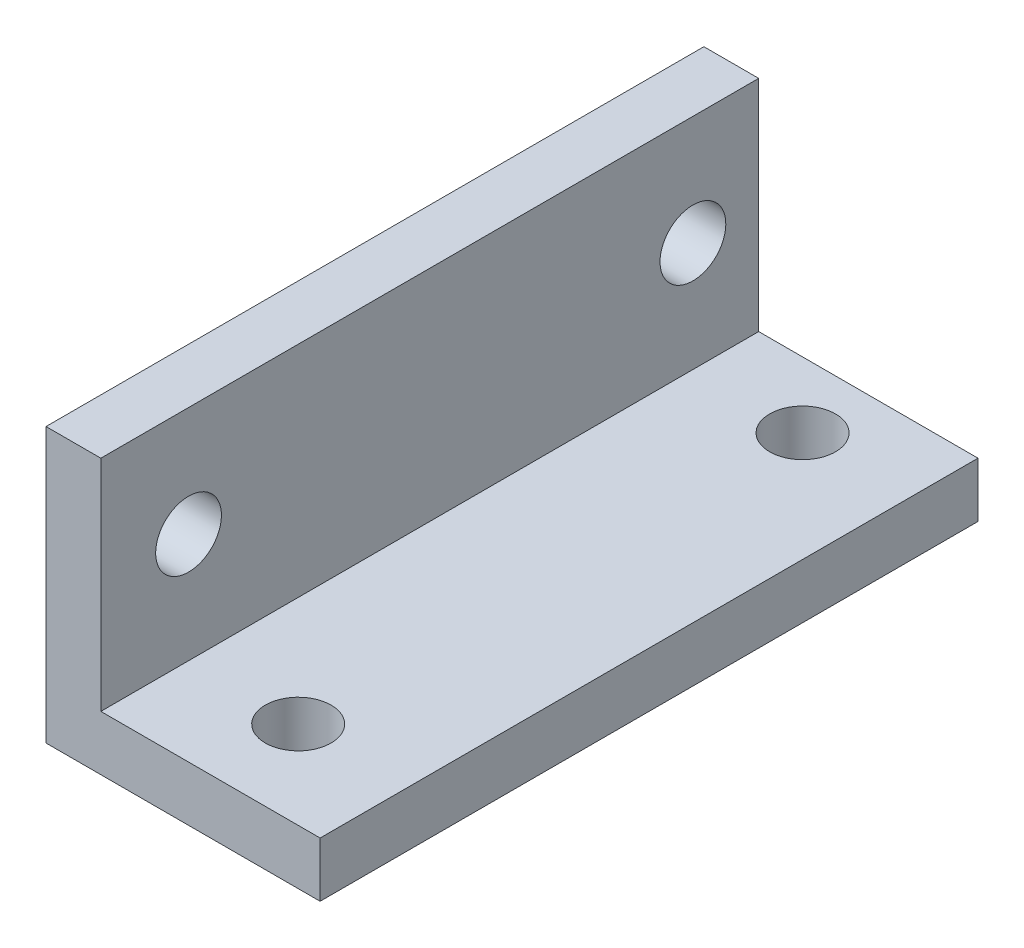
ISO-10303-21;
HEADER;
FILE_DESCRIPTION(('STEP AP214'),'2;1');
FILE_NAME('part.step','',(''),(''),'','','');
FILE_SCHEMA(('AUTOMOTIVE_DESIGN { 1 0 10303 214 1 1 1 1 }'));
ENDSEC;
DATA;
#1=APPLICATION_CONTEXT('core data for automotive mechanical design processes');
#2=APPLICATION_PROTOCOL_DEFINITION('international standard','automotive_design',2000,#1);
#3=PRODUCT_CONTEXT('',#1,'mechanical');
#4=PRODUCT('Part','Part','',(#3));
#5=PRODUCT_RELATED_PRODUCT_CATEGORY('part','',(#4));
#6=PRODUCT_DEFINITION_FORMATION('','',#4);
#7=PRODUCT_DEFINITION_CONTEXT('part definition',#1,'design');
#8=PRODUCT_DEFINITION('design','',#6,#7);
#9=PRODUCT_DEFINITION_SHAPE('','',#8);
#10=(LENGTH_UNIT() NAMED_UNIT(*) SI_UNIT(.MILLI.,.METRE.));
#11=(NAMED_UNIT(*) PLANE_ANGLE_UNIT() SI_UNIT($,.RADIAN.));
#12=(NAMED_UNIT(*) SI_UNIT($,.STERADIAN.) SOLID_ANGLE_UNIT());
#13=UNCERTAINTY_MEASURE_WITH_UNIT(LENGTH_MEASURE(1.E-05),#10,'distance_accuracy_value','');
#14=(GEOMETRIC_REPRESENTATION_CONTEXT(3) GLOBAL_UNCERTAINTY_ASSIGNED_CONTEXT((#13)) GLOBAL_UNIT_ASSIGNED_CONTEXT((#10,
#11,#12)) REPRESENTATION_CONTEXT('',''));
#15=CARTESIAN_POINT('',(0.,0.,0.));
#16=DIRECTION('',(0.,0.,1.));
#17=DIRECTION('',(1.,0.,0.));
#18=AXIS2_PLACEMENT_3D('',#15,#16,#17);
#19=CARTESIAN_POINT('',(0.,-25.,60.));
#20=DIRECTION('',(1.,0.,0.));
#21=DIRECTION('',(0.,0.,-1.));
#22=AXIS2_PLACEMENT_3D('',#19,#20,#21);
#23=PLANE('',#22);
#24=CARTESIAN_POINT('',(0.,-10.,6.));
#25=DIRECTION('',(1.,0.,0.));
#26=DIRECTION('',(0.,1.,0.));
#27=AXIS2_PLACEMENT_3D('',#24,#25,#26);
#28=CIRCLE('',#27,3.);
#29=CARTESIAN_POINT('',(0.,-7.,6.));
#30=VERTEX_POINT('',#29);
#31=EDGE_CURVE('E187',#30,#30,#28,.T.);
#32=ORIENTED_EDGE('',*,*,#31,.T.);
#33=EDGE_LOOP('',(#32));
#34=FACE_BOUND('',#33,.T.);
#35=CARTESIAN_POINT('',(0.,-10.,52.));
#36=DIRECTION('',(1.,0.,0.));
#37=DIRECTION('',(0.,1.,0.));
#38=AXIS2_PLACEMENT_3D('',#35,#36,#37);
#39=CIRCLE('',#38,3.);
#40=CARTESIAN_POINT('',(0.,-7.,52.));
#41=VERTEX_POINT('',#40);
#42=EDGE_CURVE('E190',#41,#41,#39,.T.);
#43=ORIENTED_EDGE('',*,*,#42,.T.);
#44=EDGE_LOOP('',(#43));
#45=FACE_BOUND('',#44,.T.);
#46=DIRECTION('',(0.,-1.,0.));
#47=VECTOR('',#46,1.);
#48=CARTESIAN_POINT('',(0.,-25.,0.));
#49=LINE('',#48,#47);
#50=CARTESIAN_POINT('',(0.,0.,0.));
#51=VERTEX_POINT('',#50);
#52=CARTESIAN_POINT('',(0.,-25.,0.));
#53=VERTEX_POINT('',#52);
#54=EDGE_CURVE('E131',#51,#53,#49,.T.);
#55=ORIENTED_EDGE('',*,*,#54,.T.);
#56=DIRECTION('',(0.,0.,-1.));
#57=VECTOR('',#56,1.);
#58=CARTESIAN_POINT('',(0.,-25.,60.));
#59=LINE('',#58,#57);
#60=CARTESIAN_POINT('',(0.,-25.,60.));
#61=VERTEX_POINT('',#60);
#62=EDGE_CURVE('E11',#61,#53,#59,.T.);
#63=ORIENTED_EDGE('',*,*,#62,.F.);
#64=DIRECTION('',(0.,-1.,0.));
#65=VECTOR('',#64,1.);
#66=CARTESIAN_POINT('',(0.,-25.,60.));
#67=LINE('',#66,#65);
#68=CARTESIAN_POINT('',(0.,0.,60.));
#69=VERTEX_POINT('',#68);
#70=EDGE_CURVE('E148',#69,#61,#67,.T.);
#71=ORIENTED_EDGE('',*,*,#70,.F.);
#72=DIRECTION('',(0.,0.,-1.));
#73=VECTOR('',#72,1.);
#74=CARTESIAN_POINT('',(0.,0.,60.));
#75=LINE('',#74,#73);
#76=EDGE_CURVE('E127',#69,#51,#75,.T.);
#77=ORIENTED_EDGE('',*,*,#76,.T.);
#78=EDGE_LOOP('',(#55,#63,#71,#77));
#79=FACE_BOUND('',#78,.T.);
#80=ADVANCED_FACE('F41',(#34,#45,#79),#23,.F.);
#81=CARTESIAN_POINT('',(25.,-25.,60.));
#82=DIRECTION('',(0.,1.,0.));
#83=DIRECTION('',(-1.,0.,0.));
#84=AXIS2_PLACEMENT_3D('',#81,#82,#83);
#85=PLANE('',#84);
#86=CARTESIAN_POINT('',(15.,-25.,6.));
#87=DIRECTION('',(0.,1.,0.));
#88=DIRECTION('',(-1.,0.,0.));
#89=AXIS2_PLACEMENT_3D('',#86,#87,#88);
#90=CIRCLE('',#89,3.);
#91=CARTESIAN_POINT('',(12.,-25.,6.));
#92=VERTEX_POINT('',#91);
#93=EDGE_CURVE('E136',#92,#92,#90,.T.);
#94=ORIENTED_EDGE('',*,*,#93,.T.);
#95=EDGE_LOOP('',(#94));
#96=FACE_BOUND('',#95,.T.);
#97=CARTESIAN_POINT('',(15.,-25.,52.));
#98=DIRECTION('',(0.,1.,0.));
#99=DIRECTION('',(-1.,0.,0.));
#100=AXIS2_PLACEMENT_3D('',#97,#98,#99);
#101=CIRCLE('',#100,3.);
#102=CARTESIAN_POINT('',(12.,-25.,52.));
#103=VERTEX_POINT('',#102);
#104=EDGE_CURVE('E213',#103,#103,#101,.T.);
#105=ORIENTED_EDGE('',*,*,#104,.T.);
#106=EDGE_LOOP('',(#105));
#107=FACE_BOUND('',#106,.T.);
#108=DIRECTION('',(1.,0.,0.));
#109=VECTOR('',#108,1.);
#110=CARTESIAN_POINT('',(25.,-25.,0.));
#111=LINE('',#110,#109);
#112=CARTESIAN_POINT('',(25.,-25.,0.));
#113=VERTEX_POINT('',#112);
#114=EDGE_CURVE('E135',#53,#113,#111,.T.);
#115=ORIENTED_EDGE('',*,*,#114,.T.);
#116=DIRECTION('',(0.,0.,-1.));
#117=VECTOR('',#116,1.);
#118=CARTESIAN_POINT('',(25.,-25.,60.));
#119=LINE('',#118,#117);
#120=CARTESIAN_POINT('',(25.,-25.,60.));
#121=VERTEX_POINT('',#120);
#122=EDGE_CURVE('E50',#121,#113,#119,.T.);
#123=ORIENTED_EDGE('',*,*,#122,.F.);
#124=DIRECTION('',(1.,0.,0.));
#125=VECTOR('',#124,1.);
#126=CARTESIAN_POINT('',(25.,-25.,60.));
#127=LINE('',#126,#125);
#128=EDGE_CURVE('E95',#61,#121,#127,.T.);
#129=ORIENTED_EDGE('',*,*,#128,.F.);
#130=ORIENTED_EDGE('',*,*,#62,.T.);
#131=EDGE_LOOP('',(#115,#123,#129,#130));
#132=FACE_BOUND('',#131,.T.);
#133=ADVANCED_FACE('F178',(#96,#107,#132),#85,.F.);
#134=CARTESIAN_POINT('',(25.,-20.,60.));
#135=DIRECTION('',(-1.,0.,0.));
#136=DIRECTION('',(0.,-1.,0.));
#137=AXIS2_PLACEMENT_3D('',#134,#135,#136);
#138=PLANE('',#137);
#139=DIRECTION('',(0.,1.,0.));
#140=VECTOR('',#139,1.);
#141=CARTESIAN_POINT('',(25.,-20.,0.));
#142=LINE('',#141,#140);
#143=CARTESIAN_POINT('',(25.,-20.,0.));
#144=VERTEX_POINT('',#143);
#145=EDGE_CURVE('E139',#113,#144,#142,.T.);
#146=ORIENTED_EDGE('',*,*,#145,.T.);
#147=DIRECTION('',(0.,0.,-1.));
#148=VECTOR('',#147,1.);
#149=CARTESIAN_POINT('',(25.,-20.,60.));
#150=LINE('',#149,#148);
#151=CARTESIAN_POINT('',(25.,-20.,60.));
#152=VERTEX_POINT('',#151);
#153=EDGE_CURVE('E119',#152,#144,#150,.T.);
#154=ORIENTED_EDGE('',*,*,#153,.F.);
#155=DIRECTION('',(0.,1.,0.));
#156=VECTOR('',#155,1.);
#157=CARTESIAN_POINT('',(25.,-20.,60.));
#158=LINE('',#157,#156);
#159=EDGE_CURVE('E108',#121,#152,#158,.T.);
#160=ORIENTED_EDGE('',*,*,#159,.F.);
#161=ORIENTED_EDGE('',*,*,#122,.T.);
#162=EDGE_LOOP('',(#146,#154,#160,#161));
#163=FACE_BOUND('',#162,.T.);
#164=ADVANCED_FACE('F159',(#163),#138,.F.);
#165=CARTESIAN_POINT('',(5.,-20.,60.));
#166=DIRECTION('',(0.,-1.,0.));
#167=DIRECTION('',(0.,0.,-1.));
#168=AXIS2_PLACEMENT_3D('',#165,#166,#167);
#169=PLANE('',#168);
#170=CARTESIAN_POINT('',(15.,-20.,6.));
#171=DIRECTION('',(0.,1.,0.));
#172=DIRECTION('',(-1.,0.,0.));
#173=AXIS2_PLACEMENT_3D('',#170,#171,#172);
#174=CIRCLE('',#173,3.);
#175=CARTESIAN_POINT('',(12.,-20.,6.));
#176=VERTEX_POINT('',#175);
#177=EDGE_CURVE('E205',#176,#176,#174,.T.);
#178=ORIENTED_EDGE('',*,*,#177,.F.);
#179=EDGE_LOOP('',(#178));
#180=FACE_BOUND('',#179,.T.);
#181=CARTESIAN_POINT('',(15.,-20.,52.));
#182=DIRECTION('',(0.,1.,0.));
#183=DIRECTION('',(-1.,0.,0.));
#184=AXIS2_PLACEMENT_3D('',#181,#182,#183);
#185=CIRCLE('',#184,3.);
#186=CARTESIAN_POINT('',(12.,-20.,52.));
#187=VERTEX_POINT('',#186);
#188=EDGE_CURVE('E209',#187,#187,#185,.T.);
#189=ORIENTED_EDGE('',*,*,#188,.F.);
#190=EDGE_LOOP('',(#189));
#191=FACE_BOUND('',#190,.T.);
#192=DIRECTION('',(-1.,0.,0.));
#193=VECTOR('',#192,1.);
#194=CARTESIAN_POINT('',(5.,-20.,0.));
#195=LINE('',#194,#193);
#196=CARTESIAN_POINT('',(5.,-20.,0.));
#197=VERTEX_POINT('',#196);
#198=EDGE_CURVE('E117',#144,#197,#195,.T.);
#199=ORIENTED_EDGE('',*,*,#198,.T.);
#200=DIRECTION('',(0.,0.,-1.));
#201=VECTOR('',#200,1.);
#202=CARTESIAN_POINT('',(5.,-20.,60.));
#203=LINE('',#202,#201);
#204=CARTESIAN_POINT('',(5.,-20.,60.));
#205=VERTEX_POINT('',#204);
#206=EDGE_CURVE('E114',#205,#197,#203,.T.);
#207=ORIENTED_EDGE('',*,*,#206,.F.);
#208=DIRECTION('',(-1.,0.,0.));
#209=VECTOR('',#208,1.);
#210=CARTESIAN_POINT('',(5.,-20.,60.));
#211=LINE('',#210,#209);
#212=EDGE_CURVE('E102',#152,#205,#211,.T.);
#213=ORIENTED_EDGE('',*,*,#212,.F.);
#214=ORIENTED_EDGE('',*,*,#153,.T.);
#215=EDGE_LOOP('',(#199,#207,#213,#214));
#216=FACE_BOUND('',#215,.T.);
#217=ADVANCED_FACE('F115',(#180,#191,#216),#169,.F.);
#218=CARTESIAN_POINT('',(5.,0.,60.));
#219=DIRECTION('',(-1.,0.,0.));
#220=DIRECTION('',(0.,-1.,0.));
#221=AXIS2_PLACEMENT_3D('',#218,#219,#220);
#222=PLANE('',#221);
#223=CARTESIAN_POINT('',(5.,-10.,6.));
#224=DIRECTION('',(1.,0.,0.));
#225=DIRECTION('',(0.,1.,0.));
#226=AXIS2_PLACEMENT_3D('',#223,#224,#225);
#227=CIRCLE('',#226,3.);
#228=CARTESIAN_POINT('',(5.,-7.,6.));
#229=VERTEX_POINT('',#228);
#230=EDGE_CURVE('E198',#229,#229,#227,.T.);
#231=ORIENTED_EDGE('',*,*,#230,.F.);
#232=EDGE_LOOP('',(#231));
#233=FACE_BOUND('',#232,.T.);
#234=CARTESIAN_POINT('',(5.,-10.,52.));
#235=DIRECTION('',(1.,0.,0.));
#236=DIRECTION('',(0.,1.,0.));
#237=AXIS2_PLACEMENT_3D('',#234,#235,#236);
#238=CIRCLE('',#237,3.);
#239=CARTESIAN_POINT('',(5.,-7.,52.));
#240=VERTEX_POINT('',#239);
#241=EDGE_CURVE('E193',#240,#240,#238,.T.);
#242=ORIENTED_EDGE('',*,*,#241,.F.);
#243=EDGE_LOOP('',(#242));
#244=FACE_BOUND('',#243,.T.);
#245=DIRECTION('',(0.,1.,0.));
#246=VECTOR('',#245,1.);
#247=CARTESIAN_POINT('',(5.,0.,0.));
#248=LINE('',#247,#246);
#249=CARTESIAN_POINT('',(5.,0.,0.));
#250=VERTEX_POINT('',#249);
#251=EDGE_CURVE('E81',#197,#250,#248,.T.);
#252=ORIENTED_EDGE('',*,*,#251,.T.);
#253=DIRECTION('',(0.,0.,-1.));
#254=VECTOR('',#253,1.);
#255=CARTESIAN_POINT('',(5.,0.,60.));
#256=LINE('',#255,#254);
#257=CARTESIAN_POINT('',(5.,0.,60.));
#258=VERTEX_POINT('',#257);
#259=EDGE_CURVE('E120',#258,#250,#256,.T.);
#260=ORIENTED_EDGE('',*,*,#259,.F.);
#261=DIRECTION('',(0.,1.,0.));
#262=VECTOR('',#261,1.);
#263=CARTESIAN_POINT('',(5.,0.,60.));
#264=LINE('',#263,#262);
#265=EDGE_CURVE('E106',#205,#258,#264,.T.);
#266=ORIENTED_EDGE('',*,*,#265,.F.);
#267=ORIENTED_EDGE('',*,*,#206,.T.);
#268=EDGE_LOOP('',(#252,#260,#266,#267));
#269=FACE_BOUND('',#268,.T.);
#270=ADVANCED_FACE('F122',(#233,#244,#269),#222,.F.);
#271=CARTESIAN_POINT('',(0.,0.,60.));
#272=DIRECTION('',(0.,-1.,0.));
#273=DIRECTION('',(0.,0.,-1.));
#274=AXIS2_PLACEMENT_3D('',#271,#272,#273);
#275=PLANE('',#274);
#276=DIRECTION('',(-1.,0.,0.));
#277=VECTOR('',#276,1.);
#278=CARTESIAN_POINT('',(0.,0.,0.));
#279=LINE('',#278,#277);
#280=EDGE_CURVE('E87',#250,#51,#279,.T.);
#281=ORIENTED_EDGE('',*,*,#280,.T.);
#282=ORIENTED_EDGE('',*,*,#76,.F.);
#283=DIRECTION('',(-1.,0.,0.));
#284=VECTOR('',#283,1.);
#285=CARTESIAN_POINT('',(0.,0.,60.));
#286=LINE('',#285,#284);
#287=EDGE_CURVE('E58',#258,#69,#286,.T.);
#288=ORIENTED_EDGE('',*,*,#287,.F.);
#289=ORIENTED_EDGE('',*,*,#259,.T.);
#290=EDGE_LOOP('',(#281,#282,#288,#289));
#291=FACE_BOUND('',#290,.T.);
#292=ADVANCED_FACE('F166',(#291),#275,.F.);
#293=CARTESIAN_POINT('',(0.,0.,60.));
#294=DIRECTION('',(0.,0.,-1.));
#295=DIRECTION('',(-1.,0.,0.));
#296=AXIS2_PLACEMENT_3D('',#293,#294,#295);
#297=PLANE('',#296);
#298=ORIENTED_EDGE('',*,*,#70,.T.);
#299=ORIENTED_EDGE('',*,*,#128,.T.);
#300=ORIENTED_EDGE('',*,*,#159,.T.);
#301=ORIENTED_EDGE('',*,*,#212,.T.);
#302=ORIENTED_EDGE('',*,*,#265,.T.);
#303=ORIENTED_EDGE('',*,*,#287,.T.);
#304=EDGE_LOOP('',(#298,#299,#300,#301,#302,#303));
#305=FACE_BOUND('',#304,.T.);
#306=ADVANCED_FACE('F104',(#305),#297,.F.);
#307=CARTESIAN_POINT('',(0.,0.,0.));
#308=DIRECTION('',(0.,0.,-1.));
#309=DIRECTION('',(-1.,0.,0.));
#310=AXIS2_PLACEMENT_3D('',#307,#308,#309);
#311=PLANE('',#310);
#312=ORIENTED_EDGE('',*,*,#54,.F.);
#313=ORIENTED_EDGE('',*,*,#280,.F.);
#314=ORIENTED_EDGE('',*,*,#251,.F.);
#315=ORIENTED_EDGE('',*,*,#198,.F.);
#316=ORIENTED_EDGE('',*,*,#145,.F.);
#317=ORIENTED_EDGE('',*,*,#114,.F.);
#318=EDGE_LOOP('',(#312,#313,#314,#315,#316,#317));
#319=FACE_BOUND('',#318,.T.);
#320=ADVANCED_FACE('F162',(#319),#311,.T.);
#321=CARTESIAN_POINT('',(15.,-25.,52.));
#322=DIRECTION('',(0.,1.,0.));
#323=DIRECTION('',(-1.,0.,0.));
#324=AXIS2_PLACEMENT_3D('',#321,#322,#323);
#325=CYLINDRICAL_SURFACE('',#324,3.);
#326=ORIENTED_EDGE('',*,*,#104,.F.);
#327=EDGE_LOOP('',(#326));
#328=FACE_BOUND('',#327,.T.);
#329=ORIENTED_EDGE('',*,*,#188,.T.);
#330=EDGE_LOOP('',(#329));
#331=FACE_BOUND('',#330,.T.);
#332=ADVANCED_FACE('F258',(#328,#331),#325,.F.);
#333=CARTESIAN_POINT('',(15.,-25.,6.));
#334=DIRECTION('',(0.,1.,0.));
#335=DIRECTION('',(-1.,0.,0.));
#336=AXIS2_PLACEMENT_3D('',#333,#334,#335);
#337=CYLINDRICAL_SURFACE('',#336,3.);
#338=ORIENTED_EDGE('',*,*,#93,.F.);
#339=EDGE_LOOP('',(#338));
#340=FACE_BOUND('',#339,.T.);
#341=ORIENTED_EDGE('',*,*,#177,.T.);
#342=EDGE_LOOP('',(#341));
#343=FACE_BOUND('',#342,.T.);
#344=ADVANCED_FACE('F250',(#340,#343),#337,.F.);
#345=CARTESIAN_POINT('',(0.,-10.,52.));
#346=DIRECTION('',(1.,0.,0.));
#347=DIRECTION('',(0.,1.,0.));
#348=AXIS2_PLACEMENT_3D('',#345,#346,#347);
#349=CYLINDRICAL_SURFACE('',#348,3.);
#350=ORIENTED_EDGE('',*,*,#42,.F.);
#351=EDGE_LOOP('',(#350));
#352=FACE_BOUND('',#351,.T.);
#353=ORIENTED_EDGE('',*,*,#241,.T.);
#354=EDGE_LOOP('',(#353));
#355=FACE_BOUND('',#354,.T.);
#356=ADVANCED_FACE('F248',(#352,#355),#349,.F.);
#357=CARTESIAN_POINT('',(0.,-10.,6.));
#358=DIRECTION('',(1.,0.,0.));
#359=DIRECTION('',(0.,1.,0.));
#360=AXIS2_PLACEMENT_3D('',#357,#358,#359);
#361=CYLINDRICAL_SURFACE('',#360,3.);
#362=ORIENTED_EDGE('',*,*,#31,.F.);
#363=EDGE_LOOP('',(#362));
#364=FACE_BOUND('',#363,.T.);
#365=ORIENTED_EDGE('',*,*,#230,.T.);
#366=EDGE_LOOP('',(#365));
#367=FACE_BOUND('',#366,.T.);
#368=ADVANCED_FACE('F244',(#364,#367),#361,.F.);
#369=CLOSED_SHELL('',(#80,#133,#164,#217,#270,#292,#306,#320,#332,#344,#356,#368));
#370=MANIFOLD_SOLID_BREP('B2',#369);
#371=ADVANCED_BREP_SHAPE_REPRESENTATION('',(#18,#370),#14);
#372=SHAPE_DEFINITION_REPRESENTATION(#9,#371);
ENDSEC;
END-ISO-10303-21;
